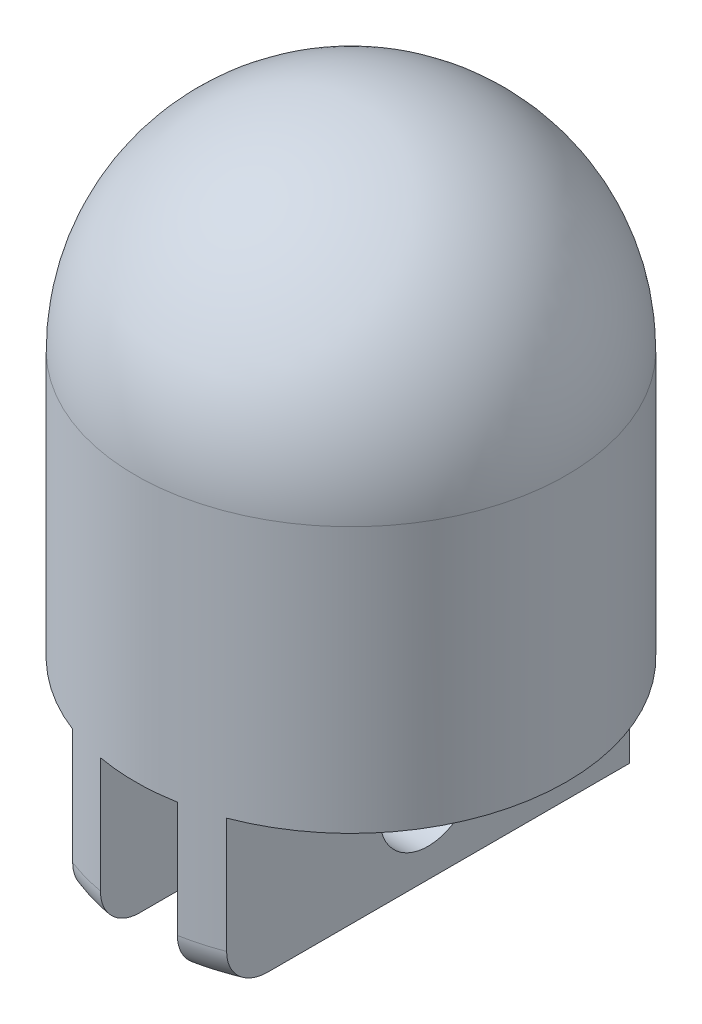
ISO-10303-21;
HEADER;
FILE_DESCRIPTION(('STEP AP214'),'2;1');
FILE_NAME('part.step','',(''),(''),'','','');
FILE_SCHEMA(('AUTOMOTIVE_DESIGN { 1 0 10303 214 1 1 1 1 }'));
ENDSEC;
DATA;
#1=APPLICATION_CONTEXT('core data for automotive mechanical design processes');
#2=APPLICATION_PROTOCOL_DEFINITION('international standard','automotive_design',2000,#1);
#3=PRODUCT_CONTEXT('',#1,'mechanical');
#4=PRODUCT('Part','Part','',(#3));
#5=PRODUCT_RELATED_PRODUCT_CATEGORY('part','',(#4));
#6=PRODUCT_DEFINITION_FORMATION('','',#4);
#7=PRODUCT_DEFINITION_CONTEXT('part definition',#1,'design');
#8=PRODUCT_DEFINITION('design','',#6,#7);
#9=PRODUCT_DEFINITION_SHAPE('','',#8);
#10=(LENGTH_UNIT() NAMED_UNIT(*) SI_UNIT(.MILLI.,.METRE.));
#11=(NAMED_UNIT(*) PLANE_ANGLE_UNIT() SI_UNIT($,.RADIAN.));
#12=(NAMED_UNIT(*) SI_UNIT($,.STERADIAN.) SOLID_ANGLE_UNIT());
#13=UNCERTAINTY_MEASURE_WITH_UNIT(LENGTH_MEASURE(1.E-05),#10,'distance_accuracy_value','');
#14=(GEOMETRIC_REPRESENTATION_CONTEXT(3) GLOBAL_UNCERTAINTY_ASSIGNED_CONTEXT((#13)) GLOBAL_UNIT_ASSIGNED_CONTEXT((#10,
#11,#12)) REPRESENTATION_CONTEXT('',''));
#15=CARTESIAN_POINT('',(0.,0.,0.));
#16=DIRECTION('',(0.,0.,1.));
#17=DIRECTION('',(1.,0.,0.));
#18=AXIS2_PLACEMENT_3D('',#15,#16,#17);
#19=CARTESIAN_POINT('',(0.,0.,0.));
#20=DIRECTION('',(0.,1.,0.));
#21=DIRECTION('',(0.,0.,1.));
#22=AXIS2_PLACEMENT_3D('',#19,#20,#21);
#23=PLANE('',#22);
#24=DIRECTION('',(0.,0.,-1.));
#25=VECTOR('',#24,1.);
#26=CARTESIAN_POINT('',(5.08,0.,13.285923979912));
#27=LINE('',#26,#25);
#28=CARTESIAN_POINT('',(5.08,0.,10.5218561100217));
#29=VERTEX_POINT('',#28);
#30=CARTESIAN_POINT('',(5.08,0.,-13.285923979912));
#31=VERTEX_POINT('',#30);
#32=EDGE_CURVE('E163',#29,#31,#27,.T.);
#33=ORIENTED_EDGE('',*,*,#32,.F.);
#34=CARTESIAN_POINT('',(0.,0.,0.));
#35=DIRECTION('',(0.,1.,0.));
#36=DIRECTION('',(0.,0.,1.));
#37=AXIS2_PLACEMENT_3D('',#34,#35,#36);
#38=CIRCLE('',#37,11.684);
#39=CARTESIAN_POINT('',(2.54,0.,11.404571714887));
#40=VERTEX_POINT('',#39);
#41=EDGE_CURVE('E285',#29,#40,#38,.F.);
#42=ORIENTED_EDGE('',*,*,#41,.T.);
#43=DIRECTION('',(0.,0.,1.));
#44=VECTOR('',#43,1.);
#45=CARTESIAN_POINT('',(2.54,0.,13.9953769509792));
#46=LINE('',#45,#44);
#47=CARTESIAN_POINT('',(2.54000000000001,0.,-13.9953769509792));
#48=VERTEX_POINT('',#47);
#49=EDGE_CURVE('E181',#48,#40,#46,.T.);
#50=ORIENTED_EDGE('',*,*,#49,.F.);
#51=CARTESIAN_POINT('',(0.,0.,0.));
#52=DIRECTION('',(0.,-1.,0.));
#53=DIRECTION('',(0.,0.,-1.));
#54=AXIS2_PLACEMENT_3D('',#51,#52,#53);
#55=CIRCLE('',#54,14.224);
#56=EDGE_CURVE('E212',#48,#31,#55,.T.);
#57=ORIENTED_EDGE('',*,*,#56,.T.);
#58=EDGE_LOOP('',(#33,#42,#50,#57));
#59=FACE_BOUND('',#58,.T.);
#60=ADVANCED_FACE('F39',(#59),#23,.F.);
#61=DIRECTION('',(0.,0.,-1.));
#62=VECTOR('',#61,1.);
#63=CARTESIAN_POINT('',(-2.54,0.,13.9953769509792));
#64=LINE('',#63,#62);
#65=CARTESIAN_POINT('',(-2.54,0.,11.404571714887));
#66=VERTEX_POINT('',#65);
#67=CARTESIAN_POINT('',(-2.54,0.,-13.9953769509792));
#68=VERTEX_POINT('',#67);
#69=EDGE_CURVE('E155',#66,#68,#64,.T.);
#70=ORIENTED_EDGE('',*,*,#69,.F.);
#71=CARTESIAN_POINT('',(0.,0.,0.));
#72=DIRECTION('',(0.,1.,0.));
#73=DIRECTION('',(0.,0.,1.));
#74=AXIS2_PLACEMENT_3D('',#71,#72,#73);
#75=CIRCLE('',#74,11.684);
#76=CARTESIAN_POINT('',(-5.08,0.,10.5218561100217));
#77=VERTEX_POINT('',#76);
#78=EDGE_CURVE('E234',#66,#77,#75,.F.);
#79=ORIENTED_EDGE('',*,*,#78,.T.);
#80=DIRECTION('',(0.,0.,1.));
#81=VECTOR('',#80,1.);
#82=CARTESIAN_POINT('',(-5.08,0.,13.285923979912));
#83=LINE('',#82,#81);
#84=CARTESIAN_POINT('',(-5.08,0.,-13.285923979912));
#85=VERTEX_POINT('',#84);
#86=EDGE_CURVE('E136',#85,#77,#83,.T.);
#87=ORIENTED_EDGE('',*,*,#86,.F.);
#88=EDGE_CURVE('E151',#85,#68,#55,.T.);
#89=ORIENTED_EDGE('',*,*,#88,.T.);
#90=EDGE_LOOP('',(#70,#79,#87,#89));
#91=FACE_BOUND('',#90,.T.);
#92=ADVANCED_FACE('F337',(#91),#23,.F.);
#93=CARTESIAN_POINT('',(0.,27.686,0.));
#94=DIRECTION('',(0.,-1.,0.));
#95=DIRECTION('',(-1.,0.,0.));
#96=AXIS2_PLACEMENT_3D('',#93,#94,#95);
#97=SPHERICAL_SURFACE('',#96,14.224);
#98=CARTESIAN_POINT('',(0.,27.686,0.));
#99=DIRECTION('',(0.,-1.,0.));
#100=DIRECTION('',(0.,0.,-1.));
#101=AXIS2_PLACEMENT_3D('',#98,#99,#100);
#102=CIRCLE('',#101,14.224);
#103=CARTESIAN_POINT('',(0.,27.686,-14.224));
#104=VERTEX_POINT('',#103);
#105=EDGE_CURVE('E216',#104,#104,#102,.T.);
#106=ORIENTED_EDGE('',*,*,#105,.F.);
#107=EDGE_LOOP('',(#106));
#108=FACE_BOUND('',#107,.T.);
#109=ADVANCED_FACE('F341',(#108),#97,.T.);
#110=CARTESIAN_POINT('',(0.,0.,0.));
#111=DIRECTION('',(0.,-1.,0.));
#112=DIRECTION('',(0.,0.,-1.));
#113=AXIS2_PLACEMENT_3D('',#110,#111,#112);
#114=CYLINDRICAL_SURFACE('',#113,14.224);
#115=DIRECTION('',(0.,-1.,0.));
#116=VECTOR('',#115,1.);
#117=CARTESIAN_POINT('',(-5.08,10.16,13.285923979912));
#118=LINE('',#117,#116);
#119=CARTESIAN_POINT('',(-5.08,10.16,13.285923979912));
#120=VERTEX_POINT('',#119);
#121=CARTESIAN_POINT('',(-5.08,2.54,13.285923979912));
#122=VERTEX_POINT('',#121);
#123=EDGE_CURVE('E143',#120,#122,#118,.T.);
#124=ORIENTED_EDGE('',*,*,#123,.T.);
#125=CARTESIAN_POINT('',(0.,2.54,0.));
#126=DIRECTION('',(0.,1.,0.));
#127=DIRECTION('',(0.,0.,1.));
#128=AXIS2_PLACEMENT_3D('',#125,#126,#127);
#129=CIRCLE('',#128,14.224);
#130=CARTESIAN_POINT('',(-2.54,2.54,13.9953769509792));
#131=VERTEX_POINT('',#130);
#132=EDGE_CURVE('E294',#122,#131,#129,.T.);
#133=ORIENTED_EDGE('',*,*,#132,.T.);
#134=DIRECTION('',(0.,-1.,0.));
#135=VECTOR('',#134,1.);
#136=CARTESIAN_POINT('',(-2.54,10.16,13.9953769509792));
#137=LINE('',#136,#135);
#138=CARTESIAN_POINT('',(-2.54,10.16,13.9953769509792));
#139=VERTEX_POINT('',#138);
#140=EDGE_CURVE('E193',#139,#131,#137,.T.);
#141=ORIENTED_EDGE('',*,*,#140,.F.);
#142=CARTESIAN_POINT('',(0.,10.16,0.));
#143=DIRECTION('',(0.,-1.,0.));
#144=DIRECTION('',(0.,0.,-1.));
#145=AXIS2_PLACEMENT_3D('',#142,#143,#144);
#146=CIRCLE('',#145,14.224);
#147=CARTESIAN_POINT('',(2.54,10.16,13.9953769509792));
#148=VERTEX_POINT('',#147);
#149=EDGE_CURVE('E176',#148,#139,#146,.T.);
#150=ORIENTED_EDGE('',*,*,#149,.F.);
#151=DIRECTION('',(0.,-1.,0.));
#152=VECTOR('',#151,1.);
#153=CARTESIAN_POINT('',(2.54,10.16,13.9953769509792));
#154=LINE('',#153,#152);
#155=CARTESIAN_POINT('',(2.54,2.54,13.9953769509792));
#156=VERTEX_POINT('',#155);
#157=EDGE_CURVE('E199',#148,#156,#154,.T.);
#158=ORIENTED_EDGE('',*,*,#157,.T.);
#159=CARTESIAN_POINT('',(0.,2.54,0.));
#160=DIRECTION('',(0.,1.,0.));
#161=DIRECTION('',(0.,0.,1.));
#162=AXIS2_PLACEMENT_3D('',#159,#160,#161);
#163=CIRCLE('',#162,14.224);
#164=CARTESIAN_POINT('',(5.08,2.54,13.285923979912));
#165=VERTEX_POINT('',#164);
#166=EDGE_CURVE('E246',#156,#165,#163,.T.);
#167=ORIENTED_EDGE('',*,*,#166,.T.);
#168=DIRECTION('',(0.,-1.,0.));
#169=VECTOR('',#168,1.);
#170=CARTESIAN_POINT('',(5.08,10.16,13.285923979912));
#171=LINE('',#170,#169);
#172=CARTESIAN_POINT('',(5.08,10.16,13.285923979912));
#173=VERTEX_POINT('',#172);
#174=EDGE_CURVE('E166',#173,#165,#171,.T.);
#175=ORIENTED_EDGE('',*,*,#174,.F.);
#176=CARTESIAN_POINT('',(0.,10.16,0.));
#177=DIRECTION('',(0.,-1.,0.));
#178=DIRECTION('',(0.,0.,-1.));
#179=AXIS2_PLACEMENT_3D('',#176,#177,#178);
#180=CIRCLE('',#179,14.224);
#181=CARTESIAN_POINT('',(5.08,10.16,-13.285923979912));
#182=VERTEX_POINT('',#181);
#183=EDGE_CURVE('E159',#182,#173,#180,.T.);
#184=ORIENTED_EDGE('',*,*,#183,.F.);
#185=DIRECTION('',(0.,-1.,0.));
#186=VECTOR('',#185,1.);
#187=CARTESIAN_POINT('',(5.08,10.16,-13.285923979912));
#188=LINE('',#187,#186);
#189=EDGE_CURVE('E170',#182,#31,#188,.T.);
#190=ORIENTED_EDGE('',*,*,#189,.T.);
#191=ORIENTED_EDGE('',*,*,#56,.F.);
#192=DIRECTION('',(0.,-1.,0.));
#193=VECTOR('',#192,1.);
#194=CARTESIAN_POINT('',(2.54000000000001,10.16,-13.9953769509792));
#195=LINE('',#194,#193);
#196=CARTESIAN_POINT('',(2.54000000000001,10.16,-13.9953769509792));
#197=VERTEX_POINT('',#196);
#198=EDGE_CURVE('E203',#197,#48,#195,.T.);
#199=ORIENTED_EDGE('',*,*,#198,.F.);
#200=CARTESIAN_POINT('',(0.,10.16,0.));
#201=DIRECTION('',(0.,-1.,0.));
#202=DIRECTION('',(0.,0.,-1.));
#203=AXIS2_PLACEMENT_3D('',#200,#201,#202);
#204=CIRCLE('',#203,14.224);
#205=CARTESIAN_POINT('',(-2.54,10.16,-13.9953769509792));
#206=VERTEX_POINT('',#205);
#207=EDGE_CURVE('E186',#206,#197,#204,.T.);
#208=ORIENTED_EDGE('',*,*,#207,.F.);
#209=DIRECTION('',(0.,-1.,0.));
#210=VECTOR('',#209,1.);
#211=CARTESIAN_POINT('',(-2.54,10.16,-13.9953769509792));
#212=LINE('',#211,#210);
#213=EDGE_CURVE('E206',#206,#68,#212,.T.);
#214=ORIENTED_EDGE('',*,*,#213,.T.);
#215=ORIENTED_EDGE('',*,*,#88,.F.);
#216=DIRECTION('',(0.,-1.,0.));
#217=VECTOR('',#216,1.);
#218=CARTESIAN_POINT('',(-5.08,10.16,-13.285923979912));
#219=LINE('',#218,#217);
#220=CARTESIAN_POINT('',(-5.08,10.16,-13.285923979912));
#221=VERTEX_POINT('',#220);
#222=EDGE_CURVE('E141',#221,#85,#219,.T.);
#223=ORIENTED_EDGE('',*,*,#222,.F.);
#224=CARTESIAN_POINT('',(0.,10.16,0.));
#225=DIRECTION('',(0.,-1.,0.));
#226=DIRECTION('',(0.,0.,-1.));
#227=AXIS2_PLACEMENT_3D('',#224,#225,#226);
#228=CIRCLE('',#227,14.224);
#229=EDGE_CURVE('E127',#120,#221,#228,.T.);
#230=ORIENTED_EDGE('',*,*,#229,.F.);
#231=EDGE_LOOP('',(#124,#133,#141,#150,#158,#167,#175,#184,#190,#191,#199,#208,#214,#215,#223,#230));
#232=FACE_BOUND('',#231,.T.);
#233=ORIENTED_EDGE('',*,*,#105,.T.);
#234=EDGE_LOOP('',(#233));
#235=FACE_BOUND('',#234,.T.);
#236=ADVANCED_FACE('F147',(#232,#235),#114,.T.);
#237=CARTESIAN_POINT('',(0.,10.16,0.));
#238=DIRECTION('',(0.,-1.,0.));
#239=DIRECTION('',(0.,0.,-1.));
#240=AXIS2_PLACEMENT_3D('',#237,#238,#239);
#241=PLANE('',#240);
#242=CARTESIAN_POINT('',(0.,10.16,0.));
#243=DIRECTION('',(0.,-1.,0.));
#244=DIRECTION('',(0.,0.,-1.));
#245=AXIS2_PLACEMENT_3D('',#242,#243,#244);
#246=CIRCLE('',#245,2.54);
#247=CARTESIAN_POINT('',(-2.54,10.16,0.));
#248=VERTEX_POINT('',#247);
#249=CARTESIAN_POINT('',(2.54,10.16,0.));
#250=VERTEX_POINT('',#249);
#251=EDGE_CURVE('E227',#248,#250,#246,.F.);
#252=ORIENTED_EDGE('',*,*,#251,.T.);
#253=DIRECTION('',(0.,0.,1.));
#254=VECTOR('',#253,1.);
#255=CARTESIAN_POINT('',(2.54,10.16,13.9953769509792));
#256=LINE('',#255,#254);
#257=EDGE_CURVE('E189',#250,#148,#256,.T.);
#258=ORIENTED_EDGE('',*,*,#257,.T.);
#259=ORIENTED_EDGE('',*,*,#149,.T.);
#260=DIRECTION('',(0.,0.,-1.));
#261=VECTOR('',#260,1.);
#262=CARTESIAN_POINT('',(-2.54,10.16,13.9953769509792));
#263=LINE('',#262,#261);
#264=EDGE_CURVE('E182',#139,#248,#263,.T.);
#265=ORIENTED_EDGE('',*,*,#264,.T.);
#266=EDGE_LOOP('',(#252,#258,#259,#265));
#267=FACE_BOUND('',#266,.T.);
#268=ADVANCED_FACE('F267',(#267),#241,.T.);
#269=EDGE_CURVE('E224',#250,#248,#246,.F.);
#270=ORIENTED_EDGE('',*,*,#269,.T.);
#271=EDGE_CURVE('E180',#248,#206,#263,.T.);
#272=ORIENTED_EDGE('',*,*,#271,.T.);
#273=ORIENTED_EDGE('',*,*,#207,.T.);
#274=EDGE_CURVE('E190',#197,#250,#256,.T.);
#275=ORIENTED_EDGE('',*,*,#274,.T.);
#276=EDGE_LOOP('',(#270,#272,#273,#275));
#277=FACE_BOUND('',#276,.T.);
#278=ADVANCED_FACE('F270',(#277),#241,.T.);
#279=CARTESIAN_POINT('',(2.54,10.16,13.9953769509792));
#280=DIRECTION('',(1.,0.,0.));
#281=DIRECTION('',(0.,0.,-1.));
#282=AXIS2_PLACEMENT_3D('',#279,#280,#281);
#283=PLANE('',#282);
#284=CARTESIAN_POINT('',(2.54,5.08,0.));
#285=DIRECTION('',(1.,0.,0.));
#286=DIRECTION('',(0.,0.,-1.));
#287=AXIS2_PLACEMENT_3D('',#284,#285,#286);
#288=CIRCLE('',#287,3.175);
#289=CARTESIAN_POINT('',(2.54,5.08,-3.175));
#290=VERTEX_POINT('',#289);
#291=EDGE_CURVE('E169',#290,#290,#288,.T.);
#292=ORIENTED_EDGE('',*,*,#291,.T.);
#293=EDGE_LOOP('',(#292));
#294=FACE_BOUND('',#293,.T.);
#295=ORIENTED_EDGE('',*,*,#49,.T.);
#296=CARTESIAN_POINT('',(2.54,0.,11.404571714887));
#297=CARTESIAN_POINT('',(2.54,1.26113473795061E-06,11.4786652814213));
#298=CARTESIAN_POINT('',(2.54,0.00309078395903239,11.5527249902188));
#299=CARTESIAN_POINT('',(2.54,0.0154385721649276,11.7003307204063));
#300=CARTESIAN_POINT('',(2.54,0.0246970668587655,11.7738767225981));
#301=CARTESIAN_POINT('',(2.54,0.061692561519822,11.9929399818542));
#302=CARTESIAN_POINT('',(2.54,0.0986496109776685,12.1370127381172));
#303=CARTESIAN_POINT('',(2.54,0.196356457013852,12.4169298038075));
#304=CARTESIAN_POINT('',(2.54,0.2571275637509,12.5527666171826));
#305=CARTESIAN_POINT('',(2.54,0.400915890850873,12.81207050289));
#306=CARTESIAN_POINT('',(2.54,0.483923181024114,12.9355430630935));
#307=CARTESIAN_POINT('',(2.54,0.668640282937397,13.1647383525689));
#308=CARTESIAN_POINT('',(2.54,0.770070831178237,13.2706861659614));
#309=CARTESIAN_POINT('',(2.54,0.989616187662205,13.4636752901056));
#310=CARTESIAN_POINT('',(2.54,1.10773392339943,13.5507132766235));
#311=CARTESIAN_POINT('',(2.54,1.35486779094815,13.7016658644638));
#312=CARTESIAN_POINT('',(2.54,1.4836386853043,13.765982609103));
#313=CARTESIAN_POINT('',(2.54,1.75021643399274,13.8716938187897));
#314=CARTESIAN_POINT('',(2.54,1.88801561339572,13.9131074780353));
#315=CARTESIAN_POINT('',(2.54,2.11239876688803,13.9600348889502));
#316=CARTESIAN_POINT('',(2.54,2.1974402388456,13.9732815083671));
#317=CARTESIAN_POINT('',(2.54,2.3683079507927,13.9909496421735));
#318=CARTESIAN_POINT('',(2.54,2.45413284786703,13.9953841478612));
#319=CARTESIAN_POINT('',(2.54,2.54,13.9953769509792));
#320=B_SPLINE_CURVE_WITH_KNOTS('',3,(#296,#297,#298,#299,#300,#301,#302,#303,#304,#305,#306,
#307,#308,#309,#310,#311,#312,#313,#314,#315,#316,#317,#318,#319),.UNSPECIFIED.,.F.,.F.,(4,2,2,
2,2,2,2,2,2,2,2,4),(0.,0.222148039542897,0.444304337205156,0.888231095477837,1.33255601489994,
1.77668283843843,2.21456741624602,2.65252890935429,3.08229672372378,3.5117038182323,
3.76948847858902,4.02689281596955),.UNSPECIFIED.);
#321=EDGE_CURVE('E54',#40,#156,#320,.T.);
#322=ORIENTED_EDGE('',*,*,#321,.T.);
#323=ORIENTED_EDGE('',*,*,#157,.F.);
#324=ORIENTED_EDGE('',*,*,#257,.F.);
#325=ORIENTED_EDGE('',*,*,#274,.F.);
#326=ORIENTED_EDGE('',*,*,#198,.T.);
#327=EDGE_LOOP('',(#295,#322,#323,#324,#325,#326));
#328=FACE_BOUND('',#327,.T.);
#329=ADVANCED_FACE('F272',(#294,#328),#283,.F.);
#330=CARTESIAN_POINT('',(-2.54,10.16,13.9953769509792));
#331=DIRECTION('',(-1.,0.,0.));
#332=DIRECTION('',(0.,0.,1.));
#333=AXIS2_PLACEMENT_3D('',#330,#331,#332);
#334=PLANE('',#333);
#335=CARTESIAN_POINT('',(-2.54,5.08,0.));
#336=DIRECTION('',(-1.,0.,0.));
#337=DIRECTION('',(0.,0.,1.));
#338=AXIS2_PLACEMENT_3D('',#335,#336,#337);
#339=CIRCLE('',#338,3.175);
#340=CARTESIAN_POINT('',(-2.54,5.08,3.175));
#341=VERTEX_POINT('',#340);
#342=EDGE_CURVE('E232',#341,#341,#339,.T.);
#343=ORIENTED_EDGE('',*,*,#342,.T.);
#344=EDGE_LOOP('',(#343));
#345=FACE_BOUND('',#344,.T.);
#346=ORIENTED_EDGE('',*,*,#140,.T.);
#347=CARTESIAN_POINT('',(-2.54,2.54,13.9953769509792));
#348=CARTESIAN_POINT('',(-2.54,2.4694377906506,13.9953843777753));
#349=CARTESIAN_POINT('',(-2.54,2.3988791087491,13.9923886050213));
#350=CARTESIAN_POINT('',(-2.54,2.25827204802834,13.9804480045302));
#351=CARTESIAN_POINT('',(-2.54,2.18822363139664,13.9715036222343));
#352=CARTESIAN_POINT('',(-2.54,2.04920993253068,13.9477368592458));
#353=CARTESIAN_POINT('',(-2.54,1.98024349309477,13.9329212771902));
#354=CARTESIAN_POINT('',(-2.54,1.84382186736519,13.8975408414632));
#355=CARTESIAN_POINT('',(-2.54,1.77636667017735,13.876976029251));
#356=CARTESIAN_POINT('',(-2.54,1.5769344908732,13.8068465965079));
#357=CARTESIAN_POINT('',(-2.54,1.44781520533232,13.7488339424253));
#358=CARTESIAN_POINT('',(-2.54,1.20115309088581,13.6121174534381));
#359=CARTESIAN_POINT('',(-2.54,1.08360950722575,13.5334149687733));
#360=CARTESIAN_POINT('',(-2.54,0.86248792003173,13.3570805958377));
#361=CARTESIAN_POINT('',(-2.54,0.75900069592147,13.2593347496432));
#362=CARTESIAN_POINT('',(-2.54,0.569596109246558,13.0480777661214));
#363=CARTESIAN_POINT('',(-2.54,0.483682103030302,12.9345636241105));
#364=CARTESIAN_POINT('',(-2.54,0.330417242833885,12.6931514673434));
#365=CARTESIAN_POINT('',(-2.54,0.263375851057855,12.5650572155428));
#366=CARTESIAN_POINT('',(-2.54,0.151307101047918,12.2995880522035));
#367=CARTESIAN_POINT('',(-2.54,0.106274510689036,12.1622153552653));
#368=CARTESIAN_POINT('',(-2.54,0.0485435771266598,11.9210365740926));
#369=CARTESIAN_POINT('',(-2.54,0.0303375287978204,11.8185103093066));
#370=CARTESIAN_POINT('',(-2.54,0.00606621787352161,11.6121894800407));
#371=CARTESIAN_POINT('',(-2.54,-1.76297601426116E-05,11.5083971029056));
#372=CARTESIAN_POINT('',(-2.54,0.,11.404571714887));
#373=B_SPLINE_CURVE_WITH_KNOTS('',3,(#347,#348,#349,#350,#351,#352,#353,#354,#355,#356,#357,
#358,#359,#360,#361,#362,#363,#364,#365,#366,#367,#368,#369,#370,#371,#372),.UNSPECIFIED.,.F.,
.F.,(4,2,2,2,2,2,2,2,2,2,2,2,4),(0.,0.211616777109325,0.423217709811453,0.634574328928521,
0.845929423936184,1.26841202845965,1.69086706817275,2.11593241059272,2.54107886154841,
2.97283695976899,3.40449236668671,3.71620177261399,4.02743291534333),.UNSPECIFIED.);
#374=EDGE_CURVE('E288',#131,#66,#373,.T.);
#375=ORIENTED_EDGE('',*,*,#374,.T.);
#376=ORIENTED_EDGE('',*,*,#69,.T.);
#377=ORIENTED_EDGE('',*,*,#213,.F.);
#378=ORIENTED_EDGE('',*,*,#271,.F.);
#379=ORIENTED_EDGE('',*,*,#264,.F.);
#380=EDGE_LOOP('',(#346,#375,#376,#377,#378,#379));
#381=FACE_BOUND('',#380,.T.);
#382=ADVANCED_FACE('F255',(#345,#381),#334,.F.);
#383=CARTESIAN_POINT('',(-5.08,10.16,13.285923979912));
#384=DIRECTION('',(1.,0.,0.));
#385=DIRECTION('',(0.,0.,-1.));
#386=AXIS2_PLACEMENT_3D('',#383,#384,#385);
#387=PLANE('',#386);
#388=CARTESIAN_POINT('',(-5.08,5.08,0.));
#389=DIRECTION('',(-1.,0.,0.));
#390=DIRECTION('',(0.,0.,1.));
#391=AXIS2_PLACEMENT_3D('',#388,#389,#390);
#392=CIRCLE('',#391,3.175);
#393=CARTESIAN_POINT('',(-5.08,5.08,3.175));
#394=VERTEX_POINT('',#393);
#395=EDGE_CURVE('E233',#394,#394,#392,.T.);
#396=ORIENTED_EDGE('',*,*,#395,.F.);
#397=EDGE_LOOP('',(#396));
#398=FACE_BOUND('',#397,.T.);
#399=ORIENTED_EDGE('',*,*,#86,.T.);
#400=CARTESIAN_POINT('',(-5.08,0.,10.5218561100217));
#401=CARTESIAN_POINT('',(-5.08,4.23526948768654E-06,10.6057146886866));
#402=CARTESIAN_POINT('',(-5.08,0.00337011361593961,10.6895406832516));
#403=CARTESIAN_POINT('',(-5.08,0.0169142680136068,10.8566673981311));
#404=CARTESIAN_POINT('',(-5.08,0.0270948542172482,10.9399679306471));
#405=CARTESIAN_POINT('',(-5.08,0.06804955724102,11.1886725763655));
#406=CARTESIAN_POINT('',(-5.08,0.109237449277015,11.35250302968));
#407=CARTESIAN_POINT('',(-5.08,0.219431444576865,11.6709685702785));
#408=CARTESIAN_POINT('',(-5.08,0.288505723937696,11.8255800482239));
#409=CARTESIAN_POINT('',(-5.08,0.453474151478706,12.1195957351759));
#410=CARTESIAN_POINT('',(-5.08,0.549325930704683,12.2590234883127));
#411=CARTESIAN_POINT('',(-5.08,0.758134408453347,12.5081749667709));
#412=CARTESIAN_POINT('',(-5.08,0.869423840424471,12.6192948609418));
#413=CARTESIAN_POINT('',(-5.08,1.11058258087668,12.8193050262275));
#414=CARTESIAN_POINT('',(-5.08,1.24045259773833,12.9081944494553));
#415=CARTESIAN_POINT('',(-5.08,1.50355295526902,13.0536332289193));
#416=CARTESIAN_POINT('',(-5.08,1.63566365884481,13.1122155188557));
#417=CARTESIAN_POINT('',(-5.08,1.90811501430823,13.2048323344631));
#418=CARTESIAN_POINT('',(-5.08,2.04844090399377,13.2389095138503));
#419=CARTESIAN_POINT('',(-5.08,2.24839296764738,13.2686718810088));
#420=CARTESIAN_POINT('',(-5.08,2.30657328845604,13.2751413598999));
#421=CARTESIAN_POINT('',(-5.08,2.42315908878708,13.2837626531662));
#422=CARTESIAN_POINT('',(-5.08,2.48156405697506,13.2859213815692));
#423=CARTESIAN_POINT('',(-5.08,2.54,13.285923979912));
#424=B_SPLINE_CURVE_WITH_KNOTS('',3,(#400,#401,#402,#403,#404,#405,#406,#407,#408,#409,#410,
#411,#412,#413,#414,#415,#416,#417,#418,#419,#420,#421,#422,#423),.UNSPECIFIED.,.F.,.F.,(4,2,2,
2,2,2,2,2,2,2,2,4),(0.,0.251438350235362,0.502961980029361,1.00712570081403,1.51252952834098,
2.01713816146429,2.48642008259756,2.95571989976699,3.38709550511017,3.81771842643914,
3.99320655468339,4.16841299010323),.UNSPECIFIED.);
#425=EDGE_CURVE('E238',#77,#122,#424,.T.);
#426=ORIENTED_EDGE('',*,*,#425,.T.);
#427=ORIENTED_EDGE('',*,*,#123,.F.);
#428=DIRECTION('',(0.,0.,1.));
#429=VECTOR('',#428,1.);
#430=CARTESIAN_POINT('',(-5.08,10.16,13.285923979912));
#431=LINE('',#430,#429);
#432=EDGE_CURVE('E130',#221,#120,#431,.T.);
#433=ORIENTED_EDGE('',*,*,#432,.F.);
#434=ORIENTED_EDGE('',*,*,#222,.T.);
#435=EDGE_LOOP('',(#399,#426,#427,#433,#434));
#436=FACE_BOUND('',#435,.T.);
#437=ADVANCED_FACE('F140',(#398,#436),#387,.F.);
#438=CARTESIAN_POINT('',(0.,10.16,0.));
#439=DIRECTION('',(0.,-1.,0.));
#440=DIRECTION('',(0.,0.,-1.));
#441=AXIS2_PLACEMENT_3D('',#438,#439,#440);
#442=PLANE('',#441);
#443=ORIENTED_EDGE('',*,*,#229,.T.);
#444=ORIENTED_EDGE('',*,*,#432,.T.);
#445=EDGE_LOOP('',(#443,#444));
#446=FACE_BOUND('',#445,.T.);
#447=ADVANCED_FACE('F129',(#446),#442,.T.);
#448=CARTESIAN_POINT('',(5.08,10.16,13.285923979912));
#449=DIRECTION('',(-1.,0.,0.));
#450=DIRECTION('',(0.,0.,1.));
#451=AXIS2_PLACEMENT_3D('',#448,#449,#450);
#452=PLANE('',#451);
#453=CARTESIAN_POINT('',(5.08,5.08,0.));
#454=DIRECTION('',(-1.,0.,0.));
#455=DIRECTION('',(0.,0.,1.));
#456=AXIS2_PLACEMENT_3D('',#453,#454,#455);
#457=CIRCLE('',#456,3.175);
#458=CARTESIAN_POINT('',(5.08,5.08,3.175));
#459=VERTEX_POINT('',#458);
#460=EDGE_CURVE('E228',#459,#459,#457,.T.);
#461=ORIENTED_EDGE('',*,*,#460,.T.);
#462=EDGE_LOOP('',(#461));
#463=FACE_BOUND('',#462,.T.);
#464=ORIENTED_EDGE('',*,*,#174,.T.);
#465=CARTESIAN_POINT('',(5.08,2.54,13.285923979912));
#466=CARTESIAN_POINT('',(5.08,2.47214804082326,13.2859331567503));
#467=CARTESIAN_POINT('',(5.08,2.40430048432014,13.2830133324826));
#468=CARTESIAN_POINT('',(5.08,2.26911361825219,13.27138620095));
#469=CARTESIAN_POINT('',(5.08,2.20177422932216,13.2626798171707));
#470=CARTESIAN_POINT('',(5.08,2.06823755589972,13.2395770989153));
#471=CARTESIAN_POINT('',(5.08,2.00203796811568,13.2251941230681));
#472=CARTESIAN_POINT('',(5.08,1.87110861865126,13.190888691986));
#473=CARTESIAN_POINT('',(5.08,1.80637886969305,13.1709661888236));
#474=CARTESIAN_POINT('',(5.08,1.61508198122574,13.1031400660263));
#475=CARTESIAN_POINT('',(5.08,1.49127737674012,13.0471550880431));
#476=CARTESIAN_POINT('',(5.08,1.25457985193197,12.9156838813346));
#477=CARTESIAN_POINT('',(5.08,1.14168996795897,12.8401922474098));
#478=CARTESIAN_POINT('',(5.08,0.926850200284785,12.6701858529884));
#479=CARTESIAN_POINT('',(5.08,0.825225731213624,12.5752600665549));
#480=CARTESIAN_POINT('',(5.08,0.638242721644264,12.3705990556837));
#481=CARTESIAN_POINT('',(5.08,0.552886350613011,12.2608618593673));
#482=CARTESIAN_POINT('',(5.08,0.395094841701925,12.0225154191751));
#483=CARTESIAN_POINT('',(5.08,0.323793163845996,11.8931569940684));
#484=CARTESIAN_POINT('',(5.08,0.202068850383155,11.6248946758459));
#485=CARTESIAN_POINT('',(5.08,0.151662338431922,11.4859835074042));
#486=CARTESIAN_POINT('',(5.08,0.0744216921550192,11.210378150993));
#487=CARTESIAN_POINT('',(5.08,0.0464048464096929,11.0740111045339));
#488=CARTESIAN_POINT('',(5.08,0.00919419781944181,10.7990234978546));
#489=CARTESIAN_POINT('',(5.08,-4.0404600009595E-05,10.6604084829094));
#490=CARTESIAN_POINT('',(5.08,0.,10.5218561100217));
#491=B_SPLINE_CURVE_WITH_KNOTS('',3,(#465,#466,#467,#468,#469,#470,#471,#472,#473,#474,#475,
#476,#477,#478,#479,#480,#481,#482,#483,#484,#485,#486,#487,#488,#489,#490),.UNSPECIFIED.,.F.,
.F.,(4,2,2,2,2,2,2,2,2,2,2,2,4),(0.,0.203485467914879,0.406938469081811,0.609915515498139,
0.812894318111057,1.21846151846282,1.62414122025563,2.03950337296842,2.45492087848941,
2.89616904338392,3.33775706435522,3.75410377080742,4.1695451014248),.UNSPECIFIED.);
#492=EDGE_CURVE('E11',#165,#29,#491,.T.);
#493=ORIENTED_EDGE('',*,*,#492,.T.);
#494=ORIENTED_EDGE('',*,*,#32,.T.);
#495=ORIENTED_EDGE('',*,*,#189,.F.);
#496=DIRECTION('',(0.,0.,-1.));
#497=VECTOR('',#496,1.);
#498=CARTESIAN_POINT('',(5.08,10.16,13.285923979912));
#499=LINE('',#498,#497);
#500=EDGE_CURVE('E162',#173,#182,#499,.T.);
#501=ORIENTED_EDGE('',*,*,#500,.F.);
#502=EDGE_LOOP('',(#464,#493,#494,#495,#501));
#503=FACE_BOUND('',#502,.T.);
#504=ADVANCED_FACE('F261',(#463,#503),#452,.F.);
#505=CARTESIAN_POINT('',(0.,10.16,0.));
#506=DIRECTION('',(0.,-1.,0.));
#507=DIRECTION('',(0.,0.,-1.));
#508=AXIS2_PLACEMENT_3D('',#505,#506,#507);
#509=PLANE('',#508);
#510=ORIENTED_EDGE('',*,*,#183,.T.);
#511=ORIENTED_EDGE('',*,*,#500,.T.);
#512=EDGE_LOOP('',(#510,#511));
#513=FACE_BOUND('',#512,.T.);
#514=ADVANCED_FACE('F258',(#513),#509,.T.);
#515=CARTESIAN_POINT('',(0.,0.,0.));
#516=DIRECTION('',(0.,-1.,0.));
#517=DIRECTION('',(0.,0.,-1.));
#518=AXIS2_PLACEMENT_3D('',#515,#516,#517);
#519=CYLINDRICAL_SURFACE('',#518,2.54);
#520=CARTESIAN_POINT('',(0.,22.86,0.));
#521=DIRECTION('',(0.,-1.,0.));
#522=DIRECTION('',(0.,0.,-1.));
#523=AXIS2_PLACEMENT_3D('',#520,#521,#522);
#524=CIRCLE('',#523,2.54);
#525=CARTESIAN_POINT('',(0.,22.86,-2.54));
#526=VERTEX_POINT('',#525);
#527=EDGE_CURVE('E220',#526,#526,#524,.T.);
#528=ORIENTED_EDGE('',*,*,#527,.F.);
#529=EDGE_LOOP('',(#528));
#530=FACE_BOUND('',#529,.T.);
#531=ORIENTED_EDGE('',*,*,#251,.F.);
#532=ORIENTED_EDGE('',*,*,#269,.F.);
#533=EDGE_LOOP('',(#531,#532));
#534=FACE_BOUND('',#533,.T.);
#535=ADVANCED_FACE('F260',(#530,#534),#519,.F.);
#536=CARTESIAN_POINT('',(0.,27.686,0.));
#537=DIRECTION('',(0.,-1.,0.));
#538=DIRECTION('',(-1.,0.,0.));
#539=AXIS2_PLACEMENT_3D('',#536,#537,#538);
#540=SPHERICAL_SURFACE('',#539,5.4536112806103);
#541=ORIENTED_EDGE('',*,*,#527,.T.);
#542=EDGE_LOOP('',(#541));
#543=FACE_BOUND('',#542,.T.);
#544=ADVANCED_FACE('F326',(#543),#540,.F.);
#545=CARTESIAN_POINT('',(14.224,5.08,0.));
#546=DIRECTION('',(-1.,0.,0.));
#547=DIRECTION('',(0.,0.,1.));
#548=AXIS2_PLACEMENT_3D('',#545,#546,#547);
#549=CYLINDRICAL_SURFACE('',#548,3.175);
#550=ORIENTED_EDGE('',*,*,#460,.F.);
#551=EDGE_LOOP('',(#550));
#552=FACE_BOUND('',#551,.T.);
#553=ORIENTED_EDGE('',*,*,#291,.F.);
#554=EDGE_LOOP('',(#553));
#555=FACE_BOUND('',#554,.T.);
#556=ADVANCED_FACE('F332',(#552,#555),#549,.F.);
#557=ORIENTED_EDGE('',*,*,#395,.T.);
#558=EDGE_LOOP('',(#557));
#559=FACE_BOUND('',#558,.T.);
#560=ORIENTED_EDGE('',*,*,#342,.F.);
#561=EDGE_LOOP('',(#560));
#562=FACE_BOUND('',#561,.T.);
#563=ADVANCED_FACE('F364',(#559,#562),#549,.F.);
#564=CARTESIAN_POINT('',(0.,2.54,0.));
#565=DIRECTION('',(0.,1.,0.));
#566=DIRECTION('',(0.,0.,1.));
#567=AXIS2_PLACEMENT_3D('',#564,#565,#566);
#568=TOROIDAL_SURFACE('',#567,11.684,2.54);
#569=ORIENTED_EDGE('',*,*,#374,.F.);
#570=ORIENTED_EDGE('',*,*,#132,.F.);
#571=ORIENTED_EDGE('',*,*,#425,.F.);
#572=ORIENTED_EDGE('',*,*,#78,.F.);
#573=EDGE_LOOP('',(#569,#570,#571,#572));
#574=FACE_BOUND('',#573,.T.);
#575=ADVANCED_FACE('F248',(#574),#568,.T.);
#576=CARTESIAN_POINT('',(0.,2.54,0.));
#577=DIRECTION('',(0.,1.,0.));
#578=DIRECTION('',(0.,0.,1.));
#579=AXIS2_PLACEMENT_3D('',#576,#577,#578);
#580=TOROIDAL_SURFACE('',#579,11.684,2.54);
#581=ORIENTED_EDGE('',*,*,#492,.F.);
#582=ORIENTED_EDGE('',*,*,#166,.F.);
#583=ORIENTED_EDGE('',*,*,#321,.F.);
#584=ORIENTED_EDGE('',*,*,#41,.F.);
#585=EDGE_LOOP('',(#581,#582,#583,#584));
#586=FACE_BOUND('',#585,.T.);
#587=ADVANCED_FACE('F41',(#586),#580,.T.);
#588=CLOSED_SHELL('',(#60,#92,#109,#236,#268,#278,#329,#382,#437,#447,#504,#514,#535,#544,#556,
#563,#575,#587));
#589=MANIFOLD_SOLID_BREP('B2',#588);
#590=ADVANCED_BREP_SHAPE_REPRESENTATION('',(#18,#589),#14);
#591=SHAPE_DEFINITION_REPRESENTATION(#9,#590);
ENDSEC;
END-ISO-10303-21;
